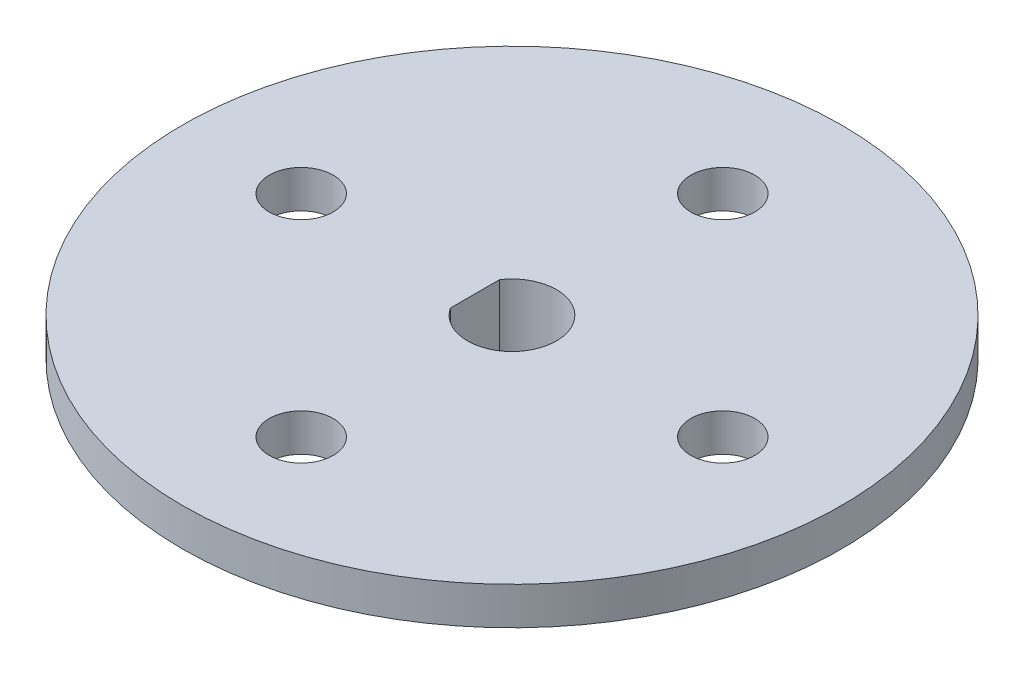
ISO-10303-21;
HEADER;
FILE_DESCRIPTION(('STEP AP214'),'2;1');
FILE_NAME('part.step','',(''),(''),'','','');
FILE_SCHEMA(('AUTOMOTIVE_DESIGN { 1 0 10303 214 1 1 1 1 }'));
ENDSEC;
DATA;
#1=APPLICATION_CONTEXT('core data for automotive mechanical design processes');
#2=APPLICATION_PROTOCOL_DEFINITION('international standard','automotive_design',2000,#1);
#3=PRODUCT_CONTEXT('',#1,'mechanical');
#4=PRODUCT('Part','Part','',(#3));
#5=PRODUCT_RELATED_PRODUCT_CATEGORY('part','',(#4));
#6=PRODUCT_DEFINITION_FORMATION('','',#4);
#7=PRODUCT_DEFINITION_CONTEXT('part definition',#1,'design');
#8=PRODUCT_DEFINITION('design','',#6,#7);
#9=PRODUCT_DEFINITION_SHAPE('','',#8);
#10=(LENGTH_UNIT() NAMED_UNIT(*) SI_UNIT(.MILLI.,.METRE.));
#11=(NAMED_UNIT(*) PLANE_ANGLE_UNIT() SI_UNIT($,.RADIAN.));
#12=(NAMED_UNIT(*) SI_UNIT($,.STERADIAN.) SOLID_ANGLE_UNIT());
#13=UNCERTAINTY_MEASURE_WITH_UNIT(LENGTH_MEASURE(1.E-05),#10,'distance_accuracy_value','');
#14=(GEOMETRIC_REPRESENTATION_CONTEXT(3) GLOBAL_UNCERTAINTY_ASSIGNED_CONTEXT((#13)) GLOBAL_UNIT_ASSIGNED_CONTEXT((#10,
#11,#12)) REPRESENTATION_CONTEXT('',''));
#15=CARTESIAN_POINT('',(0.,0.,0.));
#16=DIRECTION('',(0.,0.,1.));
#17=DIRECTION('',(1.,0.,0.));
#18=AXIS2_PLACEMENT_3D('',#15,#16,#17);
#19=CARTESIAN_POINT('',(0.,2.54,0.));
#20=DIRECTION('',(0.,-1.,0.));
#21=DIRECTION('',(0.,0.,-1.));
#22=AXIS2_PLACEMENT_3D('',#19,#20,#21);
#23=CYLINDRICAL_SURFACE('',#22,3.);
#24=DIRECTION('',(0.,-1.,0.));
#25=VECTOR('',#24,1.);
#26=CARTESIAN_POINT('',(-2.5,2.54,-1.6583123951777));
#27=LINE('',#26,#25);
#28=CARTESIAN_POINT('',(-2.5,2.54,-1.6583123951777));
#29=VERTEX_POINT('',#28);
#30=CARTESIAN_POINT('',(-2.5,-2.54,-1.6583123951777));
#31=VERTEX_POINT('',#30);
#32=EDGE_CURVE('E51',#29,#31,#27,.T.);
#33=ORIENTED_EDGE('',*,*,#32,.T.);
#34=CARTESIAN_POINT('',(0.,-2.54,0.));
#35=DIRECTION('',(0.,1.,0.));
#36=DIRECTION('',(0.,0.,1.));
#37=AXIS2_PLACEMENT_3D('',#34,#35,#36);
#38=CIRCLE('',#37,3.);
#39=CARTESIAN_POINT('',(-2.5,-2.54,1.6583123951777));
#40=VERTEX_POINT('',#39);
#41=EDGE_CURVE('E75',#40,#31,#38,.T.);
#42=ORIENTED_EDGE('',*,*,#41,.F.);
#43=DIRECTION('',(0.,-1.,0.));
#44=VECTOR('',#43,1.);
#45=CARTESIAN_POINT('',(-2.5,2.54,1.6583123951777));
#46=LINE('',#45,#44);
#47=CARTESIAN_POINT('',(-2.5,2.54,1.6583123951777));
#48=VERTEX_POINT('',#47);
#49=EDGE_CURVE('E11',#48,#40,#46,.T.);
#50=ORIENTED_EDGE('',*,*,#49,.F.);
#51=CARTESIAN_POINT('',(0.,2.54,0.));
#52=DIRECTION('',(0.,1.,0.));
#53=DIRECTION('',(0.,0.,1.));
#54=AXIS2_PLACEMENT_3D('',#51,#52,#53);
#55=CIRCLE('',#54,3.);
#56=EDGE_CURVE('E102',#48,#29,#55,.T.);
#57=ORIENTED_EDGE('',*,*,#56,.T.);
#58=EDGE_LOOP('',(#33,#42,#50,#57));
#59=FACE_BOUND('',#58,.T.);
#60=ADVANCED_FACE('F43',(#59),#23,.F.);
#61=CARTESIAN_POINT('',(14.2156421303029,2.54,0.));
#62=DIRECTION('',(0.,-1.,0.));
#63=DIRECTION('',(0.,0.,-1.));
#64=AXIS2_PLACEMENT_3D('',#61,#62,#63);
#65=CYLINDRICAL_SURFACE('',#64,2.159);
#66=CARTESIAN_POINT('',(14.2156421303029,2.54,0.));
#67=DIRECTION('',(0.,1.,0.));
#68=DIRECTION('',(0.,0.,1.));
#69=AXIS2_PLACEMENT_3D('',#66,#67,#68);
#70=CIRCLE('',#69,2.159);
#71=CARTESIAN_POINT('',(14.2156421303029,2.54,2.15900000000005));
#72=VERTEX_POINT('',#71);
#73=EDGE_CURVE('E99',#72,#72,#70,.T.);
#74=ORIENTED_EDGE('',*,*,#73,.T.);
#75=EDGE_LOOP('',(#74));
#76=FACE_BOUND('',#75,.T.);
#77=CARTESIAN_POINT('',(14.2156421303029,0.,0.));
#78=DIRECTION('',(0.,1.,0.));
#79=DIRECTION('',(0.,0.,1.));
#80=AXIS2_PLACEMENT_3D('',#77,#78,#79);
#81=CIRCLE('',#80,2.159);
#82=CARTESIAN_POINT('',(14.2156421303029,0.,2.15900000000005));
#83=VERTEX_POINT('',#82);
#84=EDGE_CURVE('E90',#83,#83,#81,.T.);
#85=ORIENTED_EDGE('',*,*,#84,.F.);
#86=EDGE_LOOP('',(#85));
#87=FACE_BOUND('',#86,.T.);
#88=ADVANCED_FACE('F121',(#76,#87),#65,.F.);
#89=CARTESIAN_POINT('',(0.,2.54,14.2156421303029));
#90=DIRECTION('',(0.,-1.,0.));
#91=DIRECTION('',(0.,0.,-1.));
#92=AXIS2_PLACEMENT_3D('',#89,#90,#91);
#93=CYLINDRICAL_SURFACE('',#92,2.159);
#94=CARTESIAN_POINT('',(0.,2.54,14.2156421303029));
#95=DIRECTION('',(0.,1.,0.));
#96=DIRECTION('',(0.,0.,1.));
#97=AXIS2_PLACEMENT_3D('',#94,#95,#96);
#98=CIRCLE('',#97,2.159);
#99=CARTESIAN_POINT('',(0.,2.54,16.3746421303029));
#100=VERTEX_POINT('',#99);
#101=EDGE_CURVE('E96',#100,#100,#98,.T.);
#102=ORIENTED_EDGE('',*,*,#101,.T.);
#103=EDGE_LOOP('',(#102));
#104=FACE_BOUND('',#103,.T.);
#105=CARTESIAN_POINT('',(0.,0.,14.2156421303029));
#106=DIRECTION('',(0.,1.,0.));
#107=DIRECTION('',(0.,0.,1.));
#108=AXIS2_PLACEMENT_3D('',#105,#106,#107);
#109=CIRCLE('',#108,2.159);
#110=CARTESIAN_POINT('',(0.,0.,16.3746421303029));
#111=VERTEX_POINT('',#110);
#112=EDGE_CURVE('E113',#111,#111,#109,.T.);
#113=ORIENTED_EDGE('',*,*,#112,.F.);
#114=EDGE_LOOP('',(#113));
#115=FACE_BOUND('',#114,.T.);
#116=ADVANCED_FACE('F123',(#104,#115),#93,.F.);
#117=CARTESIAN_POINT('',(-14.2156421303029,2.54,-1.48900947652875E-13));
#118=DIRECTION('',(0.,-1.,0.));
#119=DIRECTION('',(0.,0.,-1.));
#120=AXIS2_PLACEMENT_3D('',#117,#118,#119);
#121=CYLINDRICAL_SURFACE('',#120,2.159);
#122=CARTESIAN_POINT('',(-14.2156421303029,2.54,-1.48900947652875E-13));
#123=DIRECTION('',(0.,1.,0.));
#124=DIRECTION('',(0.,0.,1.));
#125=AXIS2_PLACEMENT_3D('',#122,#123,#124);
#126=CIRCLE('',#125,2.159);
#127=CARTESIAN_POINT('',(-14.2156421303029,2.54,2.15899999999985));
#128=VERTEX_POINT('',#127);
#129=EDGE_CURVE('E93',#128,#128,#126,.T.);
#130=ORIENTED_EDGE('',*,*,#129,.T.);
#131=EDGE_LOOP('',(#130));
#132=FACE_BOUND('',#131,.T.);
#133=CARTESIAN_POINT('',(-14.2156421303029,0.,-1.48900947652875E-13));
#134=DIRECTION('',(0.,1.,0.));
#135=DIRECTION('',(0.,0.,1.));
#136=AXIS2_PLACEMENT_3D('',#133,#134,#135);
#137=CIRCLE('',#136,2.159);
#138=CARTESIAN_POINT('',(-14.2156421303029,0.,2.15899999999985));
#139=VERTEX_POINT('',#138);
#140=EDGE_CURVE('E110',#139,#139,#137,.T.);
#141=ORIENTED_EDGE('',*,*,#140,.F.);
#142=EDGE_LOOP('',(#141));
#143=FACE_BOUND('',#142,.T.);
#144=ADVANCED_FACE('F129',(#132,#143),#121,.F.);
#145=CARTESIAN_POINT('',(0.,2.54,0.));
#146=DIRECTION('',(0.,-1.,0.));
#147=DIRECTION('',(0.,0.,-1.));
#148=AXIS2_PLACEMENT_3D('',#145,#146,#147);
#149=CYLINDRICAL_SURFACE('',#148,22.225);
#150=CARTESIAN_POINT('',(0.,2.54,0.));
#151=DIRECTION('',(0.,1.,0.));
#152=DIRECTION('',(0.,0.,1.));
#153=AXIS2_PLACEMENT_3D('',#150,#151,#152);
#154=CIRCLE('',#153,22.225);
#155=CARTESIAN_POINT('',(0.,2.54,22.225));
#156=VERTEX_POINT('',#155);
#157=EDGE_CURVE('E89',#156,#156,#154,.T.);
#158=ORIENTED_EDGE('',*,*,#157,.F.);
#159=EDGE_LOOP('',(#158));
#160=FACE_BOUND('',#159,.T.);
#161=CARTESIAN_POINT('',(0.,0.,0.));
#162=DIRECTION('',(0.,1.,0.));
#163=DIRECTION('',(0.,0.,1.));
#164=AXIS2_PLACEMENT_3D('',#161,#162,#163);
#165=CIRCLE('',#164,22.225);
#166=CARTESIAN_POINT('',(0.,0.,22.225));
#167=VERTEX_POINT('',#166);
#168=EDGE_CURVE('E107',#167,#167,#165,.T.);
#169=ORIENTED_EDGE('',*,*,#168,.T.);
#170=EDGE_LOOP('',(#169));
#171=FACE_BOUND('',#170,.T.);
#172=ADVANCED_FACE('F137',(#160,#171),#149,.T.);
#173=CARTESIAN_POINT('',(0.,2.54,-14.2156421303029));
#174=DIRECTION('',(0.,-1.,0.));
#175=DIRECTION('',(0.,0.,-1.));
#176=AXIS2_PLACEMENT_3D('',#173,#174,#175);
#177=CYLINDRICAL_SURFACE('',#176,2.159);
#178=CARTESIAN_POINT('',(0.,2.54,-14.2156421303029));
#179=DIRECTION('',(0.,1.,0.));
#180=DIRECTION('',(0.,0.,1.));
#181=AXIS2_PLACEMENT_3D('',#178,#179,#180);
#182=CIRCLE('',#181,2.159);
#183=CARTESIAN_POINT('',(0.,2.54,-12.0566421303029));
#184=VERTEX_POINT('',#183);
#185=EDGE_CURVE('E86',#184,#184,#182,.T.);
#186=ORIENTED_EDGE('',*,*,#185,.T.);
#187=EDGE_LOOP('',(#186));
#188=FACE_BOUND('',#187,.T.);
#189=CARTESIAN_POINT('',(0.,0.,-14.2156421303029));
#190=DIRECTION('',(0.,1.,0.));
#191=DIRECTION('',(0.,0.,1.));
#192=AXIS2_PLACEMENT_3D('',#189,#190,#191);
#193=CIRCLE('',#192,2.159);
#194=CARTESIAN_POINT('',(0.,0.,-12.0566421303029));
#195=VERTEX_POINT('',#194);
#196=EDGE_CURVE('E76',#195,#195,#193,.T.);
#197=ORIENTED_EDGE('',*,*,#196,.F.);
#198=EDGE_LOOP('',(#197));
#199=FACE_BOUND('',#198,.T.);
#200=ADVANCED_FACE('F45',(#188,#199),#177,.F.);
#201=CARTESIAN_POINT('',(-2.5,2.54,0.));
#202=DIRECTION('',(1.,0.,0.));
#203=DIRECTION('',(0.,0.,-1.));
#204=AXIS2_PLACEMENT_3D('',#201,#202,#203);
#205=PLANE('',#204);
#206=ORIENTED_EDGE('',*,*,#49,.T.);
#207=DIRECTION('',(0.,0.,1.));
#208=VECTOR('',#207,1.);
#209=CARTESIAN_POINT('',(-2.5,-2.54,0.));
#210=LINE('',#209,#208);
#211=EDGE_CURVE('E69',#31,#40,#210,.T.);
#212=ORIENTED_EDGE('',*,*,#211,.F.);
#213=ORIENTED_EDGE('',*,*,#32,.F.);
#214=DIRECTION('',(0.,0.,1.));
#215=VECTOR('',#214,1.);
#216=CARTESIAN_POINT('',(-2.5,2.54,0.));
#217=LINE('',#216,#215);
#218=EDGE_CURVE('E72',#29,#48,#217,.T.);
#219=ORIENTED_EDGE('',*,*,#218,.T.);
#220=EDGE_LOOP('',(#206,#212,#213,#219));
#221=FACE_BOUND('',#220,.T.);
#222=ADVANCED_FACE('F68',(#221),#205,.T.);
#223=CARTESIAN_POINT('',(0.,2.54,0.));
#224=DIRECTION('',(0.,1.,0.));
#225=DIRECTION('',(0.,0.,1.));
#226=AXIS2_PLACEMENT_3D('',#223,#224,#225);
#227=PLANE('',#226);
#228=ORIENTED_EDGE('',*,*,#185,.F.);
#229=EDGE_LOOP('',(#228));
#230=FACE_BOUND('',#229,.T.);
#231=ORIENTED_EDGE('',*,*,#157,.T.);
#232=EDGE_LOOP('',(#231));
#233=FACE_BOUND('',#232,.T.);
#234=ORIENTED_EDGE('',*,*,#129,.F.);
#235=EDGE_LOOP('',(#234));
#236=FACE_BOUND('',#235,.T.);
#237=ORIENTED_EDGE('',*,*,#101,.F.);
#238=EDGE_LOOP('',(#237));
#239=FACE_BOUND('',#238,.T.);
#240=ORIENTED_EDGE('',*,*,#73,.F.);
#241=EDGE_LOOP('',(#240));
#242=FACE_BOUND('',#241,.T.);
#243=ORIENTED_EDGE('',*,*,#56,.F.);
#244=ORIENTED_EDGE('',*,*,#218,.F.);
#245=EDGE_LOOP('',(#243,#244));
#246=FACE_BOUND('',#245,.T.);
#247=ADVANCED_FACE('F152',(#230,#233,#236,#239,#242,#246),#227,.T.);
#248=CARTESIAN_POINT('',(0.,0.,0.));
#249=DIRECTION('',(0.,1.,0.));
#250=DIRECTION('',(0.,0.,1.));
#251=AXIS2_PLACEMENT_3D('',#248,#249,#250);
#252=PLANE('',#251);
#253=CARTESIAN_POINT('',(0.,0.,0.));
#254=DIRECTION('',(0.,1.,0.));
#255=DIRECTION('',(0.,0.,1.));
#256=AXIS2_PLACEMENT_3D('',#253,#254,#255);
#257=CIRCLE('',#256,9.525);
#258=CARTESIAN_POINT('',(0.,0.,9.525));
#259=VERTEX_POINT('',#258);
#260=EDGE_CURVE('E81',#259,#259,#257,.T.);
#261=ORIENTED_EDGE('',*,*,#260,.T.);
#262=EDGE_LOOP('',(#261));
#263=FACE_BOUND('',#262,.T.);
#264=ORIENTED_EDGE('',*,*,#196,.T.);
#265=EDGE_LOOP('',(#264));
#266=FACE_BOUND('',#265,.T.);
#267=ORIENTED_EDGE('',*,*,#168,.F.);
#268=EDGE_LOOP('',(#267));
#269=FACE_BOUND('',#268,.T.);
#270=ORIENTED_EDGE('',*,*,#140,.T.);
#271=EDGE_LOOP('',(#270));
#272=FACE_BOUND('',#271,.T.);
#273=ORIENTED_EDGE('',*,*,#112,.T.);
#274=EDGE_LOOP('',(#273));
#275=FACE_BOUND('',#274,.T.);
#276=ORIENTED_EDGE('',*,*,#84,.T.);
#277=EDGE_LOOP('',(#276));
#278=FACE_BOUND('',#277,.T.);
#279=ADVANCED_FACE('F119',(#263,#266,#269,#272,#275,#278),#252,.F.);
#280=CARTESIAN_POINT('',(0.,-2.54,0.));
#281=DIRECTION('',(0.,1.,0.));
#282=DIRECTION('',(0.,0.,1.));
#283=AXIS2_PLACEMENT_3D('',#280,#281,#282);
#284=CYLINDRICAL_SURFACE('',#283,9.525);
#285=CARTESIAN_POINT('',(0.,-2.54,0.));
#286=DIRECTION('',(0.,1.,0.));
#287=DIRECTION('',(0.,0.,1.));
#288=AXIS2_PLACEMENT_3D('',#285,#286,#287);
#289=CIRCLE('',#288,9.525);
#290=CARTESIAN_POINT('',(0.,-2.54,9.525));
#291=VERTEX_POINT('',#290);
#292=EDGE_CURVE('E78',#291,#291,#289,.T.);
#293=ORIENTED_EDGE('',*,*,#292,.T.);
#294=EDGE_LOOP('',(#293));
#295=FACE_BOUND('',#294,.T.);
#296=ORIENTED_EDGE('',*,*,#260,.F.);
#297=EDGE_LOOP('',(#296));
#298=FACE_BOUND('',#297,.T.);
#299=ADVANCED_FACE('F151',(#295,#298),#284,.T.);
#300=CARTESIAN_POINT('',(0.,-2.54,0.));
#301=DIRECTION('',(0.,1.,0.));
#302=DIRECTION('',(0.,0.,1.));
#303=AXIS2_PLACEMENT_3D('',#300,#301,#302);
#304=PLANE('',#303);
#305=ORIENTED_EDGE('',*,*,#292,.F.);
#306=EDGE_LOOP('',(#305));
#307=FACE_BOUND('',#306,.T.);
#308=ORIENTED_EDGE('',*,*,#41,.T.);
#309=ORIENTED_EDGE('',*,*,#211,.T.);
#310=EDGE_LOOP('',(#308,#309));
#311=FACE_BOUND('',#310,.T.);
#312=ADVANCED_FACE('F74',(#307,#311),#304,.F.);
#313=CLOSED_SHELL('',(#60,#88,#116,#144,#172,#200,#222,#247,#279,#299,#312));
#314=MANIFOLD_SOLID_BREP('B2',#313);
#315=ADVANCED_BREP_SHAPE_REPRESENTATION('',(#18,#314),#14);
#316=SHAPE_DEFINITION_REPRESENTATION(#9,#315);
ENDSEC;
END-ISO-10303-21;
